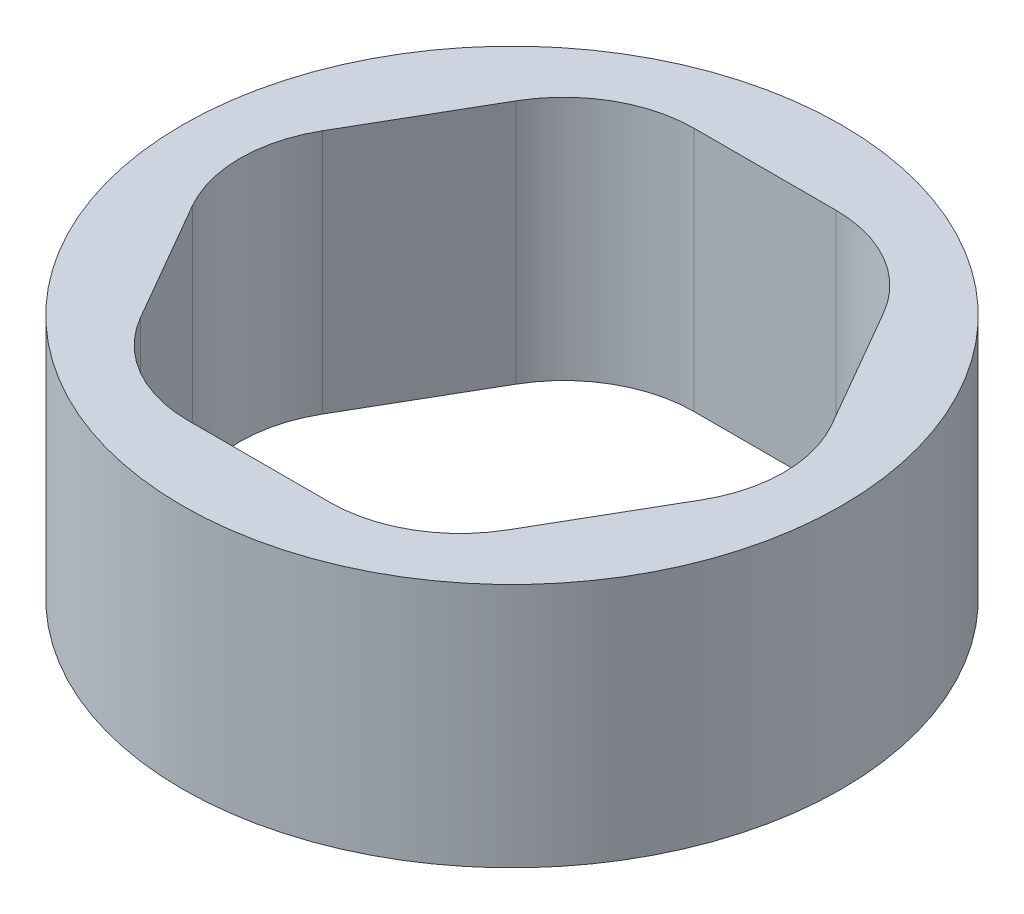
ISO-10303-21;
HEADER;
FILE_DESCRIPTION(('STEP AP214'),'2;1');
FILE_NAME('part.step','',(''),(''),'','','');
FILE_SCHEMA(('AUTOMOTIVE_DESIGN { 1 0 10303 214 1 1 1 1 }'));
ENDSEC;
DATA;
#1=APPLICATION_CONTEXT('core data for automotive mechanical design processes');
#2=APPLICATION_PROTOCOL_DEFINITION('international standard','automotive_design',2000,#1);
#3=PRODUCT_CONTEXT('',#1,'mechanical');
#4=PRODUCT('Part','Part','',(#3));
#5=PRODUCT_RELATED_PRODUCT_CATEGORY('part','',(#4));
#6=PRODUCT_DEFINITION_FORMATION('','',#4);
#7=PRODUCT_DEFINITION_CONTEXT('part definition',#1,'design');
#8=PRODUCT_DEFINITION('design','',#6,#7);
#9=PRODUCT_DEFINITION_SHAPE('','',#8);
#10=(LENGTH_UNIT() NAMED_UNIT(*) SI_UNIT(.MILLI.,.METRE.));
#11=(NAMED_UNIT(*) PLANE_ANGLE_UNIT() SI_UNIT($,.RADIAN.));
#12=(NAMED_UNIT(*) SI_UNIT($,.STERADIAN.) SOLID_ANGLE_UNIT());
#13=UNCERTAINTY_MEASURE_WITH_UNIT(LENGTH_MEASURE(1.E-05),#10,'distance_accuracy_value','');
#14=(GEOMETRIC_REPRESENTATION_CONTEXT(3) GLOBAL_UNCERTAINTY_ASSIGNED_CONTEXT((#13)) GLOBAL_UNIT_ASSIGNED_CONTEXT((#10,
#11,#12)) REPRESENTATION_CONTEXT('',''));
#15=CARTESIAN_POINT('',(0.,0.,0.));
#16=DIRECTION('',(0.,0.,1.));
#17=DIRECTION('',(1.,0.,0.));
#18=AXIS2_PLACEMENT_3D('',#15,#16,#17);
#19=CARTESIAN_POINT('',(0.,16.,0.));
#20=DIRECTION('',(0.,1.,0.));
#21=DIRECTION('',(0.,0.,1.));
#22=AXIS2_PLACEMENT_3D('',#19,#20,#21);
#23=PLANE('',#22);
#24=CARTESIAN_POINT('',(0.,16.,0.));
#25=DIRECTION('',(0.,1.,0.));
#26=DIRECTION('',(0.,0.,1.));
#27=AXIS2_PLACEMENT_3D('',#24,#25,#26);
#28=CIRCLE('',#27,21.5);
#29=CARTESIAN_POINT('',(0.,16.,21.5));
#30=VERTEX_POINT('',#29);
#31=EDGE_CURVE('E146',#30,#30,#28,.T.);
#32=ORIENTED_EDGE('',*,*,#31,.T.);
#33=EDGE_LOOP('',(#32));
#34=FACE_BOUND('',#33,.T.);
#35=DIRECTION('',(0.5,0.,-0.866025403784439));
#36=VECTOR('',#35,1.);
#37=CARTESIAN_POINT('',(9.52627944162883,16.,16.5));
#38=LINE('',#37,#36);
#39=CARTESIAN_POINT('',(11.9800180856847,16.,12.25));
#40=VERTEX_POINT('',#39);
#41=CARTESIAN_POINT('',(16.5988202392017,16.,4.25));
#42=VERTEX_POINT('',#41);
#43=EDGE_CURVE('E231',#40,#42,#38,.T.);
#44=ORIENTED_EDGE('',*,*,#43,.F.);
#45=CARTESIAN_POINT('',(4.61880215351701,16.,8.));
#46=DIRECTION('',(0.,1.,0.));
#47=DIRECTION('',(0.,0.,1.));
#48=AXIS2_PLACEMENT_3D('',#45,#46,#47);
#49=CIRCLE('',#48,8.5);
#50=CARTESIAN_POINT('',(4.61880215351701,16.,16.5));
#51=VERTEX_POINT('',#50);
#52=EDGE_CURVE('E183',#40,#51,#49,.F.);
#53=ORIENTED_EDGE('',*,*,#52,.T.);
#54=DIRECTION('',(1.,0.,0.));
#55=VECTOR('',#54,1.);
#56=CARTESIAN_POINT('',(-9.52627944162882,16.,16.5));
#57=LINE('',#56,#55);
#58=CARTESIAN_POINT('',(-4.618802153517,16.,16.5));
#59=VERTEX_POINT('',#58);
#60=EDGE_CURVE('E144',#59,#51,#57,.T.);
#61=ORIENTED_EDGE('',*,*,#60,.F.);
#62=CARTESIAN_POINT('',(-4.618802153517,16.,8.));
#63=DIRECTION('',(0.,1.,0.));
#64=DIRECTION('',(0.,0.,1.));
#65=AXIS2_PLACEMENT_3D('',#62,#63,#64);
#66=CIRCLE('',#65,8.5);
#67=CARTESIAN_POINT('',(-11.9800180856847,16.,12.25));
#68=VERTEX_POINT('',#67);
#69=EDGE_CURVE('E179',#59,#68,#66,.F.);
#70=ORIENTED_EDGE('',*,*,#69,.T.);
#71=DIRECTION('',(0.5,0.,0.866025403784439));
#72=VECTOR('',#71,1.);
#73=CARTESIAN_POINT('',(-19.0525588832576,16.,0.));
#74=LINE('',#73,#72);
#75=CARTESIAN_POINT('',(-16.5988202392017,16.,4.24999999999999));
#76=VERTEX_POINT('',#75);
#77=EDGE_CURVE('E226',#76,#68,#74,.T.);
#78=ORIENTED_EDGE('',*,*,#77,.F.);
#79=CARTESIAN_POINT('',(-9.23760430703401,16.,0.));
#80=DIRECTION('',(0.,1.,0.));
#81=DIRECTION('',(0.,0.,1.));
#82=AXIS2_PLACEMENT_3D('',#79,#80,#81);
#83=CIRCLE('',#82,8.5);
#84=CARTESIAN_POINT('',(-16.5988202392017,16.,-4.25000000000001));
#85=VERTEX_POINT('',#84);
#86=EDGE_CURVE('E11',#76,#85,#83,.F.);
#87=ORIENTED_EDGE('',*,*,#86,.T.);
#88=DIRECTION('',(-0.5,0.,0.866025403784439));
#89=VECTOR('',#88,1.);
#90=CARTESIAN_POINT('',(-9.52627944162883,16.,-16.5));
#91=LINE('',#90,#89);
#92=CARTESIAN_POINT('',(-11.9800180856847,16.,-12.25));
#93=VERTEX_POINT('',#92);
#94=EDGE_CURVE('E201',#93,#85,#91,.T.);
#95=ORIENTED_EDGE('',*,*,#94,.F.);
#96=CARTESIAN_POINT('',(-4.61880215351701,16.,-8.));
#97=DIRECTION('',(0.,1.,0.));
#98=DIRECTION('',(0.,0.,1.));
#99=AXIS2_PLACEMENT_3D('',#96,#97,#98);
#100=CIRCLE('',#99,8.5);
#101=CARTESIAN_POINT('',(-4.61880215351701,16.,-16.5));
#102=VERTEX_POINT('',#101);
#103=EDGE_CURVE('E136',#93,#102,#100,.F.);
#104=ORIENTED_EDGE('',*,*,#103,.T.);
#105=DIRECTION('',(-1.,0.,0.));
#106=VECTOR('',#105,1.);
#107=CARTESIAN_POINT('',(9.52627944162883,16.,-16.5));
#108=LINE('',#107,#106);
#109=CARTESIAN_POINT('',(4.61880215351701,16.,-16.5));
#110=VERTEX_POINT('',#109);
#111=EDGE_CURVE('E199',#110,#102,#108,.T.);
#112=ORIENTED_EDGE('',*,*,#111,.F.);
#113=CARTESIAN_POINT('',(4.61880215351701,16.,-8.));
#114=DIRECTION('',(0.,1.,0.));
#115=DIRECTION('',(0.,0.,1.));
#116=AXIS2_PLACEMENT_3D('',#113,#114,#115);
#117=CIRCLE('',#116,8.5);
#118=CARTESIAN_POINT('',(11.9800180856847,16.,-12.25));
#119=VERTEX_POINT('',#118);
#120=EDGE_CURVE('E191',#110,#119,#117,.F.);
#121=ORIENTED_EDGE('',*,*,#120,.T.);
#122=DIRECTION('',(-0.5,0.,-0.866025403784439));
#123=VECTOR('',#122,1.);
#124=CARTESIAN_POINT('',(19.0525588832577,16.,0.));
#125=LINE('',#124,#123);
#126=CARTESIAN_POINT('',(16.5988202392017,16.,-4.25));
#127=VERTEX_POINT('',#126);
#128=EDGE_CURVE('E209',#127,#119,#125,.T.);
#129=ORIENTED_EDGE('',*,*,#128,.F.);
#130=CARTESIAN_POINT('',(9.23760430703401,16.,0.));
#131=DIRECTION('',(0.,1.,0.));
#132=DIRECTION('',(0.,0.,1.));
#133=AXIS2_PLACEMENT_3D('',#130,#131,#132);
#134=CIRCLE('',#133,8.5);
#135=EDGE_CURVE('E187',#127,#42,#134,.F.);
#136=ORIENTED_EDGE('',*,*,#135,.T.);
#137=EDGE_LOOP('',(#44,#53,#61,#70,#78,#87,#95,#104,#112,#121,#129,#136));
#138=FACE_BOUND('',#137,.T.);
#139=ADVANCED_FACE('F39',(#34,#138),#23,.T.);
#140=CARTESIAN_POINT('',(0.,0.,0.));
#141=DIRECTION('',(0.,1.,0.));
#142=DIRECTION('',(0.,0.,1.));
#143=AXIS2_PLACEMENT_3D('',#140,#141,#142);
#144=PLANE('',#143);
#145=CARTESIAN_POINT('',(0.,0.,0.));
#146=DIRECTION('',(0.,1.,0.));
#147=DIRECTION('',(0.,0.,1.));
#148=AXIS2_PLACEMENT_3D('',#145,#146,#147);
#149=CIRCLE('',#148,21.5);
#150=CARTESIAN_POINT('',(0.,0.,21.5));
#151=VERTEX_POINT('',#150);
#152=EDGE_CURVE('E151',#151,#151,#149,.T.);
#153=ORIENTED_EDGE('',*,*,#152,.F.);
#154=EDGE_LOOP('',(#153));
#155=FACE_BOUND('',#154,.T.);
#156=DIRECTION('',(0.5,0.,0.866025403784439));
#157=VECTOR('',#156,1.);
#158=CARTESIAN_POINT('',(-19.0525588832576,0.,0.));
#159=LINE('',#158,#157);
#160=CARTESIAN_POINT('',(-16.5988202392017,0.,4.24999999999999));
#161=VERTEX_POINT('',#160);
#162=CARTESIAN_POINT('',(-11.9800180856847,0.,12.25));
#163=VERTEX_POINT('',#162);
#164=EDGE_CURVE('E130',#161,#163,#159,.T.);
#165=ORIENTED_EDGE('',*,*,#164,.T.);
#166=CARTESIAN_POINT('',(-4.618802153517,0.,8.));
#167=DIRECTION('',(0.,1.,0.));
#168=DIRECTION('',(0.,0.,1.));
#169=AXIS2_PLACEMENT_3D('',#166,#167,#168);
#170=CIRCLE('',#169,8.5);
#171=CARTESIAN_POINT('',(-4.618802153517,0.,16.5));
#172=VERTEX_POINT('',#171);
#173=EDGE_CURVE('E177',#163,#172,#170,.T.);
#174=ORIENTED_EDGE('',*,*,#173,.T.);
#175=DIRECTION('',(1.,0.,0.));
#176=VECTOR('',#175,1.);
#177=CARTESIAN_POINT('',(-9.52627944162882,0.,16.5));
#178=LINE('',#177,#176);
#179=CARTESIAN_POINT('',(4.61880215351701,0.,16.5));
#180=VERTEX_POINT('',#179);
#181=EDGE_CURVE('E223',#172,#180,#178,.T.);
#182=ORIENTED_EDGE('',*,*,#181,.T.);
#183=CARTESIAN_POINT('',(4.61880215351701,0.,8.));
#184=DIRECTION('',(0.,1.,0.));
#185=DIRECTION('',(0.,0.,1.));
#186=AXIS2_PLACEMENT_3D('',#183,#184,#185);
#187=CIRCLE('',#186,8.5);
#188=CARTESIAN_POINT('',(11.9800180856847,0.,12.25));
#189=VERTEX_POINT('',#188);
#190=EDGE_CURVE('E181',#180,#189,#187,.T.);
#191=ORIENTED_EDGE('',*,*,#190,.T.);
#192=DIRECTION('',(0.5,0.,-0.866025403784439));
#193=VECTOR('',#192,1.);
#194=CARTESIAN_POINT('',(9.52627944162883,0.,16.5));
#195=LINE('',#194,#193);
#196=CARTESIAN_POINT('',(16.5988202392017,0.,4.25));
#197=VERTEX_POINT('',#196);
#198=EDGE_CURVE('E220',#189,#197,#195,.T.);
#199=ORIENTED_EDGE('',*,*,#198,.T.);
#200=CARTESIAN_POINT('',(9.23760430703401,0.,0.));
#201=DIRECTION('',(0.,1.,0.));
#202=DIRECTION('',(0.,0.,1.));
#203=AXIS2_PLACEMENT_3D('',#200,#201,#202);
#204=CIRCLE('',#203,8.5);
#205=CARTESIAN_POINT('',(16.5988202392017,0.,-4.25));
#206=VERTEX_POINT('',#205);
#207=EDGE_CURVE('E185',#197,#206,#204,.T.);
#208=ORIENTED_EDGE('',*,*,#207,.T.);
#209=DIRECTION('',(-0.5,0.,-0.866025403784439));
#210=VECTOR('',#209,1.);
#211=CARTESIAN_POINT('',(19.0525588832577,0.,0.));
#212=LINE('',#211,#210);
#213=CARTESIAN_POINT('',(11.9800180856847,0.,-12.25));
#214=VERTEX_POINT('',#213);
#215=EDGE_CURVE('E215',#206,#214,#212,.T.);
#216=ORIENTED_EDGE('',*,*,#215,.T.);
#217=CARTESIAN_POINT('',(4.61880215351701,0.,-8.));
#218=DIRECTION('',(0.,1.,0.));
#219=DIRECTION('',(0.,0.,1.));
#220=AXIS2_PLACEMENT_3D('',#217,#218,#219);
#221=CIRCLE('',#220,8.5);
#222=CARTESIAN_POINT('',(4.61880215351701,0.,-16.5));
#223=VERTEX_POINT('',#222);
#224=EDGE_CURVE('E189',#214,#223,#221,.T.);
#225=ORIENTED_EDGE('',*,*,#224,.T.);
#226=DIRECTION('',(-1.,0.,0.));
#227=VECTOR('',#226,1.);
#228=CARTESIAN_POINT('',(9.52627944162883,0.,-16.5));
#229=LINE('',#228,#227);
#230=CARTESIAN_POINT('',(-4.61880215351701,0.,-16.5));
#231=VERTEX_POINT('',#230);
#232=EDGE_CURVE('E212',#223,#231,#229,.T.);
#233=ORIENTED_EDGE('',*,*,#232,.T.);
#234=CARTESIAN_POINT('',(-4.61880215351701,0.,-8.));
#235=DIRECTION('',(0.,1.,0.));
#236=DIRECTION('',(0.,0.,1.));
#237=AXIS2_PLACEMENT_3D('',#234,#235,#236);
#238=CIRCLE('',#237,8.5);
#239=CARTESIAN_POINT('',(-11.9800180856847,0.,-12.25));
#240=VERTEX_POINT('',#239);
#241=EDGE_CURVE('E193',#231,#240,#238,.T.);
#242=ORIENTED_EDGE('',*,*,#241,.T.);
#243=DIRECTION('',(-0.5,0.,0.866025403784439));
#244=VECTOR('',#243,1.);
#245=CARTESIAN_POINT('',(-9.52627944162883,0.,-16.5));
#246=LINE('',#245,#244);
#247=CARTESIAN_POINT('',(-16.5988202392017,0.,-4.25000000000001));
#248=VERTEX_POINT('',#247);
#249=EDGE_CURVE('E131',#240,#248,#246,.T.);
#250=ORIENTED_EDGE('',*,*,#249,.T.);
#251=CARTESIAN_POINT('',(-9.23760430703401,0.,0.));
#252=DIRECTION('',(0.,1.,0.));
#253=DIRECTION('',(0.,0.,1.));
#254=AXIS2_PLACEMENT_3D('',#251,#252,#253);
#255=CIRCLE('',#254,8.5);
#256=EDGE_CURVE('E47',#248,#161,#255,.T.);
#257=ORIENTED_EDGE('',*,*,#256,.T.);
#258=EDGE_LOOP('',(#165,#174,#182,#191,#199,#208,#216,#225,#233,#242,#250,#257));
#259=FACE_BOUND('',#258,.T.);
#260=ADVANCED_FACE('F129',(#155,#259),#144,.F.);
#261=CARTESIAN_POINT('',(0.,16.,0.));
#262=DIRECTION('',(0.,-1.,0.));
#263=DIRECTION('',(0.,0.,-1.));
#264=AXIS2_PLACEMENT_3D('',#261,#262,#263);
#265=CYLINDRICAL_SURFACE('',#264,21.5);
#266=ORIENTED_EDGE('',*,*,#31,.F.);
#267=EDGE_LOOP('',(#266));
#268=FACE_BOUND('',#267,.T.);
#269=ORIENTED_EDGE('',*,*,#152,.T.);
#270=EDGE_LOOP('',(#269));
#271=FACE_BOUND('',#270,.T.);
#272=ADVANCED_FACE('F275',(#268,#271),#265,.T.);
#273=CARTESIAN_POINT('',(-9.52627944162882,16.,16.5));
#274=DIRECTION('',(0.,0.,-1.));
#275=DIRECTION('',(-1.,0.,0.));
#276=AXIS2_PLACEMENT_3D('',#273,#274,#275);
#277=PLANE('',#276);
#278=ORIENTED_EDGE('',*,*,#181,.F.);
#279=DIRECTION('',(0.,-1.,0.));
#280=VECTOR('',#279,1.);
#281=CARTESIAN_POINT('',(-4.618802153517,16.,16.5));
#282=LINE('',#281,#280);
#283=EDGE_CURVE('E157',#172,#59,#282,.F.);
#284=ORIENTED_EDGE('',*,*,#283,.T.);
#285=ORIENTED_EDGE('',*,*,#60,.T.);
#286=DIRECTION('',(0.,-1.,0.));
#287=VECTOR('',#286,1.);
#288=CARTESIAN_POINT('',(4.61880215351701,0.,16.5));
#289=LINE('',#288,#287);
#290=EDGE_CURVE('E148',#51,#180,#289,.T.);
#291=ORIENTED_EDGE('',*,*,#290,.T.);
#292=EDGE_LOOP('',(#278,#284,#285,#291));
#293=FACE_BOUND('',#292,.T.);
#294=ADVANCED_FACE('F239',(#293),#277,.T.);
#295=CARTESIAN_POINT('',(9.52627944162883,16.,16.5));
#296=DIRECTION('',(-0.866025403784439,0.,-0.5));
#297=DIRECTION('',(-0.5,0.,0.866025403784439));
#298=AXIS2_PLACEMENT_3D('',#295,#296,#297);
#299=PLANE('',#298);
#300=ORIENTED_EDGE('',*,*,#198,.F.);
#301=DIRECTION('',(0.,-1.,0.));
#302=VECTOR('',#301,1.);
#303=CARTESIAN_POINT('',(11.9800180856847,16.,12.25));
#304=LINE('',#303,#302);
#305=EDGE_CURVE('E162',#189,#40,#304,.F.);
#306=ORIENTED_EDGE('',*,*,#305,.T.);
#307=ORIENTED_EDGE('',*,*,#43,.T.);
#308=DIRECTION('',(0.,-1.,0.));
#309=VECTOR('',#308,1.);
#310=CARTESIAN_POINT('',(16.5988202392017,0.,4.25));
#311=LINE('',#310,#309);
#312=EDGE_CURVE('E159',#42,#197,#311,.T.);
#313=ORIENTED_EDGE('',*,*,#312,.T.);
#314=EDGE_LOOP('',(#300,#306,#307,#313));
#315=FACE_BOUND('',#314,.T.);
#316=ADVANCED_FACE('F248',(#315),#299,.T.);
#317=CARTESIAN_POINT('',(19.0525588832577,16.,0.));
#318=DIRECTION('',(-0.866025403784439,0.,0.5));
#319=DIRECTION('',(0.5,0.,0.866025403784439));
#320=AXIS2_PLACEMENT_3D('',#317,#318,#319);
#321=PLANE('',#320);
#322=ORIENTED_EDGE('',*,*,#215,.F.);
#323=DIRECTION('',(0.,-1.,0.));
#324=VECTOR('',#323,1.);
#325=CARTESIAN_POINT('',(16.5988202392017,16.,-4.25));
#326=LINE('',#325,#324);
#327=EDGE_CURVE('E167',#206,#127,#326,.F.);
#328=ORIENTED_EDGE('',*,*,#327,.T.);
#329=ORIENTED_EDGE('',*,*,#128,.T.);
#330=DIRECTION('',(0.,-1.,0.));
#331=VECTOR('',#330,1.);
#332=CARTESIAN_POINT('',(11.9800180856847,0.,-12.25));
#333=LINE('',#332,#331);
#334=EDGE_CURVE('E164',#119,#214,#333,.T.);
#335=ORIENTED_EDGE('',*,*,#334,.T.);
#336=EDGE_LOOP('',(#322,#328,#329,#335));
#337=FACE_BOUND('',#336,.T.);
#338=ADVANCED_FACE('F256',(#337),#321,.T.);
#339=CARTESIAN_POINT('',(9.52627944162883,16.,-16.5));
#340=DIRECTION('',(0.,0.,1.));
#341=DIRECTION('',(1.,0.,0.));
#342=AXIS2_PLACEMENT_3D('',#339,#340,#341);
#343=PLANE('',#342);
#344=ORIENTED_EDGE('',*,*,#232,.F.);
#345=DIRECTION('',(0.,-1.,0.));
#346=VECTOR('',#345,1.);
#347=CARTESIAN_POINT('',(4.61880215351701,16.,-16.5));
#348=LINE('',#347,#346);
#349=EDGE_CURVE('E172',#223,#110,#348,.F.);
#350=ORIENTED_EDGE('',*,*,#349,.T.);
#351=ORIENTED_EDGE('',*,*,#111,.T.);
#352=DIRECTION('',(0.,-1.,0.));
#353=VECTOR('',#352,1.);
#354=CARTESIAN_POINT('',(-4.61880215351701,0.,-16.5));
#355=LINE('',#354,#353);
#356=EDGE_CURVE('E169',#102,#231,#355,.T.);
#357=ORIENTED_EDGE('',*,*,#356,.T.);
#358=EDGE_LOOP('',(#344,#350,#351,#357));
#359=FACE_BOUND('',#358,.T.);
#360=ADVANCED_FACE('F206',(#359),#343,.T.);
#361=CARTESIAN_POINT('',(-9.52627944162883,16.,-16.5));
#362=DIRECTION('',(0.866025403784439,0.,0.5));
#363=DIRECTION('',(0.5,0.,-0.866025403784439));
#364=AXIS2_PLACEMENT_3D('',#361,#362,#363);
#365=PLANE('',#364);
#366=ORIENTED_EDGE('',*,*,#249,.F.);
#367=DIRECTION('',(0.,-1.,0.));
#368=VECTOR('',#367,1.);
#369=CARTESIAN_POINT('',(-11.9800180856847,16.,-12.25));
#370=LINE('',#369,#368);
#371=EDGE_CURVE('E59',#240,#93,#370,.F.);
#372=ORIENTED_EDGE('',*,*,#371,.T.);
#373=ORIENTED_EDGE('',*,*,#94,.T.);
#374=DIRECTION('',(0.,-1.,0.));
#375=VECTOR('',#374,1.);
#376=CARTESIAN_POINT('',(-16.5988202392017,0.,-4.25000000000001));
#377=LINE('',#376,#375);
#378=EDGE_CURVE('E174',#85,#248,#377,.T.);
#379=ORIENTED_EDGE('',*,*,#378,.T.);
#380=EDGE_LOOP('',(#366,#372,#373,#379));
#381=FACE_BOUND('',#380,.T.);
#382=ADVANCED_FACE('F213',(#381),#365,.T.);
#383=CARTESIAN_POINT('',(-19.0525588832576,16.,0.));
#384=DIRECTION('',(0.866025403784439,0.,-0.5));
#385=DIRECTION('',(-0.5,0.,-0.866025403784439));
#386=AXIS2_PLACEMENT_3D('',#383,#384,#385);
#387=PLANE('',#386);
#388=ORIENTED_EDGE('',*,*,#77,.T.);
#389=DIRECTION('',(0.,-1.,0.));
#390=VECTOR('',#389,1.);
#391=CARTESIAN_POINT('',(-11.9800180856847,0.,12.25));
#392=LINE('',#391,#390);
#393=EDGE_CURVE('E143',#68,#163,#392,.T.);
#394=ORIENTED_EDGE('',*,*,#393,.T.);
#395=ORIENTED_EDGE('',*,*,#164,.F.);
#396=DIRECTION('',(0.,-1.,0.));
#397=VECTOR('',#396,1.);
#398=CARTESIAN_POINT('',(-16.5988202392017,16.,4.24999999999999));
#399=LINE('',#398,#397);
#400=EDGE_CURVE('E141',#161,#76,#399,.F.);
#401=ORIENTED_EDGE('',*,*,#400,.T.);
#402=EDGE_LOOP('',(#388,#394,#395,#401));
#403=FACE_BOUND('',#402,.T.);
#404=ADVANCED_FACE('F140',(#403),#387,.T.);
#405=CARTESIAN_POINT('',(-4.618802153517,16.,8.));
#406=DIRECTION('',(0.,1.,0.));
#407=DIRECTION('',(0.,0.,1.));
#408=AXIS2_PLACEMENT_3D('',#405,#406,#407);
#409=CYLINDRICAL_SURFACE('',#408,8.5);
#410=ORIENTED_EDGE('',*,*,#69,.F.);
#411=ORIENTED_EDGE('',*,*,#283,.F.);
#412=ORIENTED_EDGE('',*,*,#173,.F.);
#413=ORIENTED_EDGE('',*,*,#393,.F.);
#414=EDGE_LOOP('',(#410,#411,#412,#413));
#415=FACE_BOUND('',#414,.T.);
#416=ADVANCED_FACE('F283',(#415),#409,.F.);
#417=CARTESIAN_POINT('',(4.61880215351701,16.,8.));
#418=DIRECTION('',(0.,1.,0.));
#419=DIRECTION('',(0.,0.,1.));
#420=AXIS2_PLACEMENT_3D('',#417,#418,#419);
#421=CYLINDRICAL_SURFACE('',#420,8.5);
#422=ORIENTED_EDGE('',*,*,#52,.F.);
#423=ORIENTED_EDGE('',*,*,#305,.F.);
#424=ORIENTED_EDGE('',*,*,#190,.F.);
#425=ORIENTED_EDGE('',*,*,#290,.F.);
#426=EDGE_LOOP('',(#422,#423,#424,#425));
#427=FACE_BOUND('',#426,.T.);
#428=ADVANCED_FACE('F244',(#427),#421,.F.);
#429=CARTESIAN_POINT('',(9.23760430703401,16.,0.));
#430=DIRECTION('',(0.,1.,0.));
#431=DIRECTION('',(0.,0.,1.));
#432=AXIS2_PLACEMENT_3D('',#429,#430,#431);
#433=CYLINDRICAL_SURFACE('',#432,8.5);
#434=ORIENTED_EDGE('',*,*,#135,.F.);
#435=ORIENTED_EDGE('',*,*,#327,.F.);
#436=ORIENTED_EDGE('',*,*,#207,.F.);
#437=ORIENTED_EDGE('',*,*,#312,.F.);
#438=EDGE_LOOP('',(#434,#435,#436,#437));
#439=FACE_BOUND('',#438,.T.);
#440=ADVANCED_FACE('F252',(#439),#433,.F.);
#441=CARTESIAN_POINT('',(4.61880215351701,16.,-8.));
#442=DIRECTION('',(0.,1.,0.));
#443=DIRECTION('',(0.,0.,1.));
#444=AXIS2_PLACEMENT_3D('',#441,#442,#443);
#445=CYLINDRICAL_SURFACE('',#444,8.5);
#446=ORIENTED_EDGE('',*,*,#120,.F.);
#447=ORIENTED_EDGE('',*,*,#349,.F.);
#448=ORIENTED_EDGE('',*,*,#224,.F.);
#449=ORIENTED_EDGE('',*,*,#334,.F.);
#450=EDGE_LOOP('',(#446,#447,#448,#449));
#451=FACE_BOUND('',#450,.T.);
#452=ADVANCED_FACE('F260',(#451),#445,.F.);
#453=CARTESIAN_POINT('',(-4.61880215351701,16.,-8.));
#454=DIRECTION('',(0.,1.,0.));
#455=DIRECTION('',(0.,0.,1.));
#456=AXIS2_PLACEMENT_3D('',#453,#454,#455);
#457=CYLINDRICAL_SURFACE('',#456,8.5);
#458=ORIENTED_EDGE('',*,*,#103,.F.);
#459=ORIENTED_EDGE('',*,*,#371,.F.);
#460=ORIENTED_EDGE('',*,*,#241,.F.);
#461=ORIENTED_EDGE('',*,*,#356,.F.);
#462=EDGE_LOOP('',(#458,#459,#460,#461));
#463=FACE_BOUND('',#462,.T.);
#464=ADVANCED_FACE('F211',(#463),#457,.F.);
#465=CARTESIAN_POINT('',(-9.23760430703401,16.,0.));
#466=DIRECTION('',(0.,1.,0.));
#467=DIRECTION('',(0.,0.,1.));
#468=AXIS2_PLACEMENT_3D('',#465,#466,#467);
#469=CYLINDRICAL_SURFACE('',#468,8.5);
#470=ORIENTED_EDGE('',*,*,#86,.F.);
#471=ORIENTED_EDGE('',*,*,#400,.F.);
#472=ORIENTED_EDGE('',*,*,#256,.F.);
#473=ORIENTED_EDGE('',*,*,#378,.F.);
#474=EDGE_LOOP('',(#470,#471,#472,#473));
#475=FACE_BOUND('',#474,.T.);
#476=ADVANCED_FACE('F41',(#475),#469,.F.);
#477=CLOSED_SHELL('',(#139,#260,#272,#294,#316,#338,#360,#382,#404,#416,#428,#440,#452,#464,#476));
#478=MANIFOLD_SOLID_BREP('B2',#477);
#479=ADVANCED_BREP_SHAPE_REPRESENTATION('',(#18,#478),#14);
#480=SHAPE_DEFINITION_REPRESENTATION(#9,#479);
ENDSEC;
END-ISO-10303-21;
